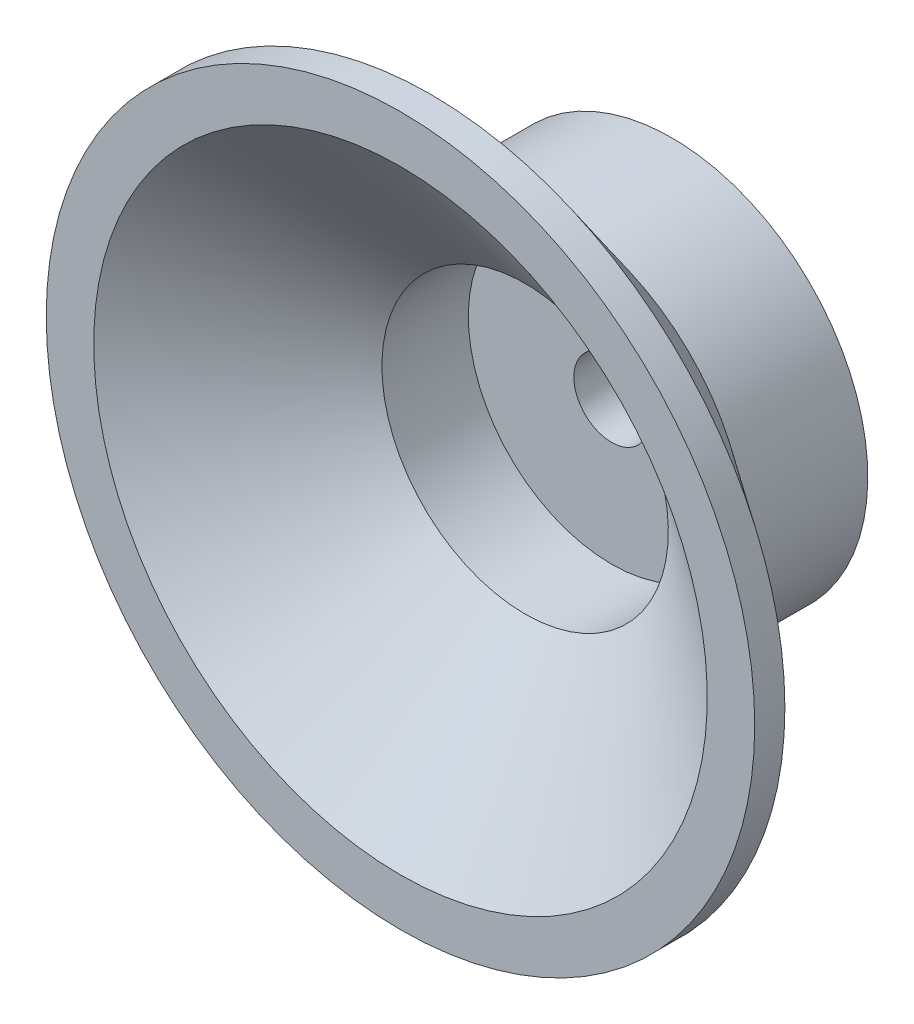
ISO-10303-21;
HEADER;
FILE_DESCRIPTION(('STEP AP214'),'2;1');
FILE_NAME('part.step','',(''),(''),'','','');
FILE_SCHEMA(('AUTOMOTIVE_DESIGN { 1 0 10303 214 1 1 1 1 }'));
ENDSEC;
DATA;
#1=APPLICATION_CONTEXT('core data for automotive mechanical design processes');
#2=APPLICATION_PROTOCOL_DEFINITION('international standard','automotive_design',2000,#1);
#3=PRODUCT_CONTEXT('',#1,'mechanical');
#4=PRODUCT('Part','Part','',(#3));
#5=PRODUCT_RELATED_PRODUCT_CATEGORY('part','',(#4));
#6=PRODUCT_DEFINITION_FORMATION('','',#4);
#7=PRODUCT_DEFINITION_CONTEXT('part definition',#1,'design');
#8=PRODUCT_DEFINITION('design','',#6,#7);
#9=PRODUCT_DEFINITION_SHAPE('','',#8);
#10=(LENGTH_UNIT() NAMED_UNIT(*) SI_UNIT(.MILLI.,.METRE.));
#11=(NAMED_UNIT(*) PLANE_ANGLE_UNIT() SI_UNIT($,.RADIAN.));
#12=(NAMED_UNIT(*) SI_UNIT($,.STERADIAN.) SOLID_ANGLE_UNIT());
#13=UNCERTAINTY_MEASURE_WITH_UNIT(LENGTH_MEASURE(1.E-05),#10,'distance_accuracy_value','');
#14=(GEOMETRIC_REPRESENTATION_CONTEXT(3) GLOBAL_UNCERTAINTY_ASSIGNED_CONTEXT((#13)) GLOBAL_UNIT_ASSIGNED_CONTEXT((#10,
#11,#12)) REPRESENTATION_CONTEXT('',''));
#15=CARTESIAN_POINT('',(0.,0.,0.));
#16=DIRECTION('',(0.,0.,1.));
#17=DIRECTION('',(1.,0.,0.));
#18=AXIS2_PLACEMENT_3D('',#15,#16,#17);
#19=CARTESIAN_POINT('',(34.2362330813529,17.2088140824005,33.2763067760068));
#20=DIRECTION('',(0.,-2.38589787038279E-07,-0.999999999999972));
#21=DIRECTION('',(0.,0.999999999999972,-2.38589787038279E-07));
#22=AXIS2_PLACEMENT_3D('',#19,#20,#21);
#23=CYLINDRICAL_SURFACE('',#22,2.5);
#24=CARTESIAN_POINT('',(34.2362330813529,17.2088146192275,35.5263069201939));
#25=DIRECTION('',(0.,-2.38589787038279E-07,-0.999999999999972));
#26=DIRECTION('',(0.,0.999999999999972,-2.38589787038279E-07));
#27=AXIS2_PLACEMENT_3D('',#24,#25,#26);
#28=CIRCLE('',#27,2.5);
#29=CARTESIAN_POINT('',(34.2362330813529,14.7088146192276,35.5263075166684));
#30=VERTEX_POINT('',#29);
#31=EDGE_CURVE('E27',#30,#30,#28,.T.);
#32=ORIENTED_EDGE('',*,*,#31,.F.);
#33=DIRECTION('',(0.,-2.38589788609666E-07,-0.999999999999972));
#34=VECTOR('',#33,1.);
#35=CARTESIAN_POINT('',(34.2362330813529,14.7088140824005,33.2763073724812));
#36=LINE('',#35,#34);
#37=CARTESIAN_POINT('',(34.2362330813529,14.7088136648684,31.526307228294));
#38=VERTEX_POINT('',#37);
#39=EDGE_CURVE('E11',#30,#38,#36,.T.);
#40=ORIENTED_EDGE('',*,*,#39,.T.);
#41=CARTESIAN_POINT('',(34.2362330813529,17.2088136648683,31.5263066318196));
#42=DIRECTION('',(0.,-2.38589788609667E-07,-0.999999999999972));
#43=DIRECTION('',(1.,0.,0.));
#44=AXIS2_PLACEMENT_3D('',#41,#42,#43);
#45=CIRCLE('',#44,2.5);
#46=EDGE_CURVE('E99',#38,#38,#45,.T.);
#47=ORIENTED_EDGE('',*,*,#46,.T.);
#48=ORIENTED_EDGE('',*,*,#39,.F.);
#49=EDGE_LOOP('',(#32,#40,#47,#48));
#50=FACE_BOUND('',#49,.T.);
#51=ADVANCED_FACE('F17',(#50),#23,.F.);
#52=CARTESIAN_POINT('',(34.2362330813529,19.7088146192275,35.5263063237195));
#53=DIRECTION('',(0.,-2.38589788609667E-07,-0.999999999999972));
#54=DIRECTION('',(0.,-0.999999999999972,2.38589788609667E-07));
#55=AXIS2_PLACEMENT_3D('',#52,#53,#54);
#56=PLANE('',#55);
#57=ORIENTED_EDGE('',*,*,#31,.T.);
#58=EDGE_LOOP('',(#57));
#59=FACE_BOUND('',#58,.T.);
#60=CARTESIAN_POINT('',(34.2362330813529,17.2088146192275,35.5263069201939));
#61=DIRECTION('',(0.,-2.38589787038279E-07,-0.999999999999972));
#62=DIRECTION('',(0.,0.999999999999972,-2.38589787038279E-07));
#63=AXIS2_PLACEMENT_3D('',#60,#61,#62);
#64=CIRCLE('',#63,9.50000057284007);
#65=CARTESIAN_POINT('',(34.2362330813529,7.70881404638773,35.5263091867971));
#66=VERTEX_POINT('',#65);
#67=EDGE_CURVE('E110',#66,#66,#64,.T.);
#68=ORIENTED_EDGE('',*,*,#67,.F.);
#69=EDGE_LOOP('',(#68));
#70=FACE_BOUND('',#69,.T.);
#71=ADVANCED_FACE('F158',(#59,#70),#56,.F.);
#72=CARTESIAN_POINT('',(34.2362330813529,17.2088152435525,38.1430363741536));
#73=DIRECTION('',(0.,-2.38589787038279E-07,-0.999999999999972));
#74=DIRECTION('',(0.,0.999999999999972,-2.38589787038279E-07));
#75=AXIS2_PLACEMENT_3D('',#72,#73,#74);
#76=CYLINDRICAL_SURFACE('',#75,9.50000057284007);
#77=CARTESIAN_POINT('',(34.2362330813529,17.2088159871724,41.2597664341347));
#78=DIRECTION('',(0.,-2.38589788609667E-07,-0.999999999999972));
#79=DIRECTION('',(1.,0.,0.));
#80=AXIS2_PLACEMENT_3D('',#77,#78,#79);
#81=CIRCLE('',#80,9.5000008426694);
#82=CARTESIAN_POINT('',(34.2362330813529,7.7088151445033,41.2597687007378));
#83=VERTEX_POINT('',#82);
#84=EDGE_CURVE('E20',#83,#83,#81,.T.);
#85=ORIENTED_EDGE('',*,*,#84,.F.);
#86=DIRECTION('',(0.,-2.38589788609666E-07,-0.999999999999971));
#87=VECTOR('',#86,1.);
#88=CARTESIAN_POINT('',(34.2362330813529,7.70881467071266,38.1430386407567));
#89=LINE('',#88,#87);
#90=EDGE_CURVE('E106',#83,#66,#89,.T.);
#91=ORIENTED_EDGE('',*,*,#90,.T.);
#92=ORIENTED_EDGE('',*,*,#67,.T.);
#93=ORIENTED_EDGE('',*,*,#90,.F.);
#94=EDGE_LOOP('',(#85,#91,#92,#93));
#95=FACE_BOUND('',#94,.T.);
#96=ADVANCED_FACE('F163',(#95),#76,.F.);
#97=CARTESIAN_POINT('',(34.2362330813529,17.2088169733285,45.3930365329769));
#98=DIRECTION('',(0.,2.38589787038279E-07,0.999999999999972));
#99=DIRECTION('',(0.,0.999999999999972,-2.38589787038279E-07));
#100=AXIS2_PLACEMENT_3D('',#97,#98,#99);
#101=CONICAL_SURFACE('',#100,14.9249175873396,0.919719582241073);
#102=CARTESIAN_POINT('',(34.2362330813529,17.2088179594845,49.5263066318191));
#103=DIRECTION('',(0.,-2.38589788609667E-07,-0.999999999999972));
#104=DIRECTION('',(1.,0.,0.));
#105=AXIS2_PLACEMENT_3D('',#102,#103,#104);
#106=CIRCLE('',#105,20.3498343320097);
#107=CARTESIAN_POINT('',(34.2362330813529,-3.14101637252468,49.5263114870817));
#108=VERTEX_POINT('',#107);
#109=EDGE_CURVE('E83',#108,#108,#106,.T.);
#110=ORIENTED_EDGE('',*,*,#109,.F.);
#111=DIRECTION('',(0.,0.795431561431488,-0.606043423426626));
#112=VECTOR('',#111,1.);
#113=CARTESIAN_POINT('',(34.2362330813529,2.28389938598932,45.3930400939098));
#114=LINE('',#113,#112);
#115=EDGE_CURVE('E91',#108,#83,#114,.T.);
#116=ORIENTED_EDGE('',*,*,#115,.T.);
#117=ORIENTED_EDGE('',*,*,#84,.T.);
#118=ORIENTED_EDGE('',*,*,#115,.F.);
#119=EDGE_LOOP('',(#110,#116,#117,#118));
#120=FACE_BOUND('',#119,.T.);
#121=ADVANCED_FACE('F184',(#120),#101,.F.);
#122=CARTESIAN_POINT('',(34.2362330813529,37.5586522914937,49.5263017765564));
#123=DIRECTION('',(0.,-2.38589788609667E-07,-0.999999999999972));
#124=DIRECTION('',(0.,-0.999999999999972,2.38589788609667E-07));
#125=AXIS2_PLACEMENT_3D('',#122,#123,#124);
#126=PLANE('',#125);
#127=ORIENTED_EDGE('',*,*,#109,.T.);
#128=EDGE_LOOP('',(#127));
#129=FACE_BOUND('',#128,.T.);
#130=CARTESIAN_POINT('',(34.2362330813529,17.2088179594845,49.5263066318191));
#131=DIRECTION('',(0.,-2.38589788609667E-07,-0.999999999999972));
#132=DIRECTION('',(1.,0.,0.));
#133=AXIS2_PLACEMENT_3D('',#130,#131,#132);
#134=CIRCLE('',#133,23.5);
#135=CARTESIAN_POINT('',(34.2362330813529,-6.29118204051484,49.5263122386791));
#136=VERTEX_POINT('',#135);
#137=EDGE_CURVE('E80',#136,#136,#134,.T.);
#138=ORIENTED_EDGE('',*,*,#137,.F.);
#139=EDGE_LOOP('',(#138));
#140=FACE_BOUND('',#139,.T.);
#141=ADVANCED_FACE('F175',(#129,#140),#126,.F.);
#142=CARTESIAN_POINT('',(34.2362330813529,17.2088177208947,48.5263066318191));
#143=DIRECTION('',(0.,-2.38589787038279E-07,-0.999999999999972));
#144=DIRECTION('',(0.,0.999999999999972,-2.38589787038279E-07));
#145=AXIS2_PLACEMENT_3D('',#142,#143,#144);
#146=CYLINDRICAL_SURFACE('',#145,23.5);
#147=ORIENTED_EDGE('',*,*,#137,.T.);
#148=DIRECTION('',(0.,-2.38589788609666E-07,-0.999999999999971));
#149=VECTOR('',#148,1.);
#150=CARTESIAN_POINT('',(34.2362330813529,-6.29118227910463,48.5263122386791));
#151=LINE('',#150,#149);
#152=CARTESIAN_POINT('',(34.2362330813529,-6.29118251769443,47.5263122386791));
#153=VERTEX_POINT('',#152);
#154=EDGE_CURVE('E76',#136,#153,#151,.T.);
#155=ORIENTED_EDGE('',*,*,#154,.T.);
#156=CARTESIAN_POINT('',(34.2362330813529,17.2088174823049,47.5263066318191));
#157=DIRECTION('',(0.,-2.38589788609667E-07,-0.999999999999972));
#158=DIRECTION('',(1.,0.,0.));
#159=AXIS2_PLACEMENT_3D('',#156,#157,#158);
#160=CIRCLE('',#159,23.5);
#161=EDGE_CURVE('E81',#153,#153,#160,.T.);
#162=ORIENTED_EDGE('',*,*,#161,.F.);
#163=ORIENTED_EDGE('',*,*,#154,.F.);
#164=EDGE_LOOP('',(#147,#155,#162,#163));
#165=FACE_BOUND('',#164,.T.);
#166=ADVANCED_FACE('F78',(#165),#146,.T.);
#167=CARTESIAN_POINT('',(34.2362330813529,17.2088165279458,43.5263067039128));
#168=DIRECTION('',(0.,2.38589787038279E-07,0.999999999999972));
#169=DIRECTION('',(0.,0.999999999999972,-2.38589787038279E-07));
#170=AXIS2_PLACEMENT_3D('',#167,#168,#169);
#171=CONICAL_SURFACE('',#170,18.250000346298,0.919719582241074);
#172=ORIENTED_EDGE('',*,*,#161,.T.);
#173=DIRECTION('',(0.,0.795431561431489,-0.606043423426625));
#174=VECTOR('',#173,1.);
#175=CARTESIAN_POINT('',(34.2362330813529,-1.0411838183517,43.5263110581765));
#176=LINE('',#175,#174);
#177=CARTESIAN_POINT('',(34.2362330813529,4.20881522728901,39.5263098776739));
#178=VERTEX_POINT('',#177);
#179=EDGE_CURVE('E66',#153,#178,#176,.T.);
#180=ORIENTED_EDGE('',*,*,#179,.T.);
#181=CARTESIAN_POINT('',(34.2362330813529,17.2088155735867,39.5263067760065));
#182=DIRECTION('',(0.,-2.38589788609667E-07,-0.999999999999972));
#183=DIRECTION('',(1.,0.,0.));
#184=AXIS2_PLACEMENT_3D('',#181,#182,#183);
#185=CIRCLE('',#184,13.000000692596);
#186=EDGE_CURVE('E105',#178,#178,#185,.T.);
#187=ORIENTED_EDGE('',*,*,#186,.F.);
#188=ORIENTED_EDGE('',*,*,#179,.F.);
#189=EDGE_LOOP('',(#172,#180,#187,#188));
#190=FACE_BOUND('',#189,.T.);
#191=ADVANCED_FACE('F174',(#190),#171,.T.);
#192=CARTESIAN_POINT('',(34.2362330813529,17.2088146192274,35.5263063935842));
#193=DIRECTION('',(0.,-2.38589787038279E-07,-0.999999999999972));
#194=DIRECTION('',(0.,0.999999999999972,-2.38589787038279E-07));
#195=AXIS2_PLACEMENT_3D('',#192,#193,#194);
#196=CYLINDRICAL_SURFACE('',#195,13.000000346298);
#197=ORIENTED_EDGE('',*,*,#186,.T.);
#198=DIRECTION('',(0.,-2.38589788609667E-07,-0.999999999999971));
#199=VECTOR('',#198,1.);
#200=CARTESIAN_POINT('',(34.2362330813529,4.20881427292976,35.5263094952515));
#201=LINE('',#200,#199);
#202=CARTESIAN_POINT('',(34.2362330813529,4.20881331857052,31.5263091128292));
#203=VERTEX_POINT('',#202);
#204=EDGE_CURVE('E102',#178,#203,#201,.T.);
#205=ORIENTED_EDGE('',*,*,#204,.T.);
#206=CARTESIAN_POINT('',(34.2362330813529,17.2088136648682,31.5263060111619));
#207=DIRECTION('',(0.,-2.38589788609667E-07,-0.999999999999972));
#208=DIRECTION('',(1.,0.,0.));
#209=AXIS2_PLACEMENT_3D('',#206,#207,#208);
#210=CIRCLE('',#209,13.);
#211=EDGE_CURVE('E95',#203,#203,#210,.T.);
#212=ORIENTED_EDGE('',*,*,#211,.F.);
#213=ORIENTED_EDGE('',*,*,#204,.F.);
#214=EDGE_LOOP('',(#197,#205,#212,#213));
#215=FACE_BOUND('',#214,.T.);
#216=ADVANCED_FACE('F193',(#215),#196,.T.);
#217=CARTESIAN_POINT('',(34.2362330813529,30.2088136648678,31.5263029094946));
#218=DIRECTION('',(0.,2.38589788609667E-07,0.999999999999972));
#219=DIRECTION('',(1.,0.,0.));
#220=AXIS2_PLACEMENT_3D('',#217,#218,#219);
#221=PLANE('',#220);
#222=ORIENTED_EDGE('',*,*,#46,.F.);
#223=EDGE_LOOP('',(#222));
#224=FACE_BOUND('',#223,.T.);
#225=ORIENTED_EDGE('',*,*,#211,.T.);
#226=EDGE_LOOP('',(#225));
#227=FACE_BOUND('',#226,.T.);
#228=ADVANCED_FACE('F198',(#224,#227),#221,.F.);
#229=CLOSED_SHELL('',(#51,#71,#96,#121,#141,#166,#191,#216,#228));
#230=MANIFOLD_SOLID_BREP('B1',#229);
#231=ADVANCED_BREP_SHAPE_REPRESENTATION('',(#18,#230),#14);
#232=SHAPE_DEFINITION_REPRESENTATION(#9,#231);
ENDSEC;
END-ISO-10303-21;
